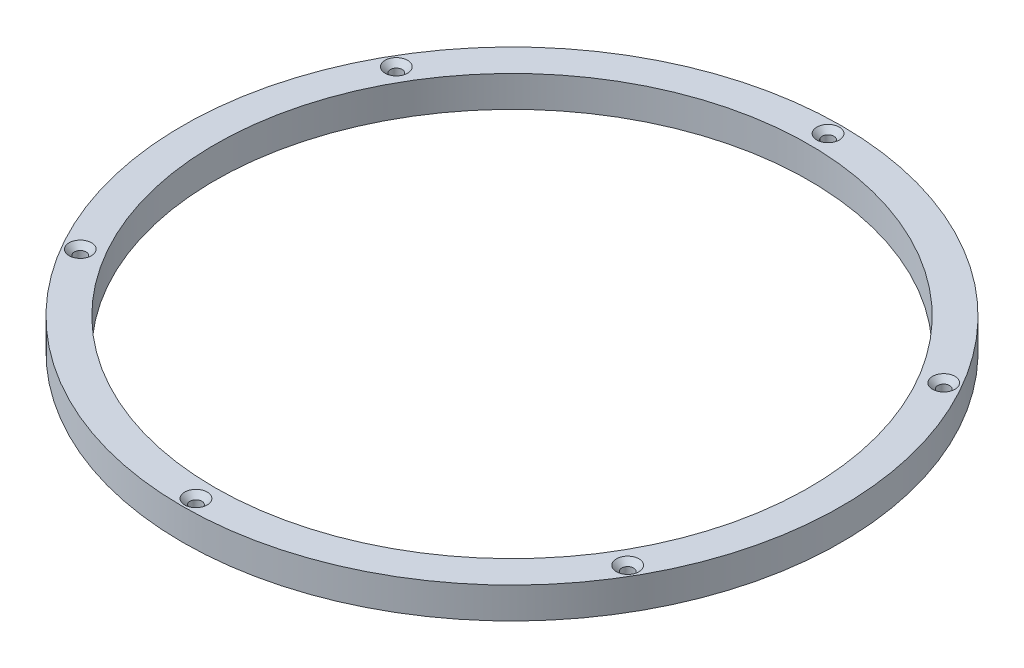
ISO-10303-21;
HEADER;
FILE_DESCRIPTION(('STEP AP214'),'2;1');
FILE_NAME('part.step','',(''),(''),'','','');
FILE_SCHEMA(('AUTOMOTIVE_DESIGN { 1 0 10303 214 1 1 1 1 }'));
ENDSEC;
DATA;
#1=APPLICATION_CONTEXT('core data for automotive mechanical design processes');
#2=APPLICATION_PROTOCOL_DEFINITION('international standard','automotive_design',2000,#1);
#3=PRODUCT_CONTEXT('',#1,'mechanical');
#4=PRODUCT('Part','Part','',(#3));
#5=PRODUCT_RELATED_PRODUCT_CATEGORY('part','',(#4));
#6=PRODUCT_DEFINITION_FORMATION('','',#4);
#7=PRODUCT_DEFINITION_CONTEXT('part definition',#1,'design');
#8=PRODUCT_DEFINITION('design','',#6,#7);
#9=PRODUCT_DEFINITION_SHAPE('','',#8);
#10=(LENGTH_UNIT() NAMED_UNIT(*) SI_UNIT(.MILLI.,.METRE.));
#11=(NAMED_UNIT(*) PLANE_ANGLE_UNIT() SI_UNIT($,.RADIAN.));
#12=(NAMED_UNIT(*) SI_UNIT($,.STERADIAN.) SOLID_ANGLE_UNIT());
#13=UNCERTAINTY_MEASURE_WITH_UNIT(LENGTH_MEASURE(1.E-05),#10,'distance_accuracy_value','');
#14=(GEOMETRIC_REPRESENTATION_CONTEXT(3) GLOBAL_UNCERTAINTY_ASSIGNED_CONTEXT((#13)) GLOBAL_UNIT_ASSIGNED_CONTEXT((#10,
#11,#12)) REPRESENTATION_CONTEXT('',''));
#15=CARTESIAN_POINT('',(0.,0.,0.));
#16=DIRECTION('',(0.,0.,1.));
#17=DIRECTION('',(1.,0.,0.));
#18=AXIS2_PLACEMENT_3D('',#15,#16,#17);
#19=CARTESIAN_POINT('',(0.,14.4,0.));
#20=DIRECTION('',(0.,1.,0.));
#21=DIRECTION('',(0.,0.,1.));
#22=AXIS2_PLACEMENT_3D('',#19,#20,#21);
#23=PLANE('',#22);
#24=CARTESIAN_POINT('',(126.656215303473,14.4,-73.1250000000015));
#25=DIRECTION('',(0.,1.,0.));
#26=DIRECTION('',(0.,0.,1.));
#27=AXIS2_PLACEMENT_3D('',#24,#25,#26);
#28=CIRCLE('',#27,5.20000000000001);
#29=CARTESIAN_POINT('',(126.656215303473,14.4,-67.9250000000015));
#30=VERTEX_POINT('',#29);
#31=EDGE_CURVE('E100',#30,#30,#28,.T.);
#32=ORIENTED_EDGE('',*,*,#31,.F.);
#33=EDGE_LOOP('',(#32));
#34=FACE_BOUND('',#33,.T.);
#35=CARTESIAN_POINT('',(126.656215303475,14.4,73.1249999999988));
#36=DIRECTION('',(0.,1.,0.));
#37=DIRECTION('',(0.,0.,1.));
#38=AXIS2_PLACEMENT_3D('',#35,#36,#37);
#39=CIRCLE('',#38,5.20000000000001);
#40=CARTESIAN_POINT('',(126.656215303475,14.4,78.3249999999988));
#41=VERTEX_POINT('',#40);
#42=EDGE_CURVE('E91',#41,#41,#39,.T.);
#43=ORIENTED_EDGE('',*,*,#42,.F.);
#44=EDGE_LOOP('',(#43));
#45=FACE_BOUND('',#44,.T.);
#46=CARTESIAN_POINT('',(0.,14.4,146.25));
#47=DIRECTION('',(0.,1.,0.));
#48=DIRECTION('',(0.,0.,1.));
#49=AXIS2_PLACEMENT_3D('',#46,#47,#48);
#50=CIRCLE('',#49,5.2);
#51=CARTESIAN_POINT('',(0.,14.4,151.45));
#52=VERTEX_POINT('',#51);
#53=EDGE_CURVE('E82',#52,#52,#50,.T.);
#54=ORIENTED_EDGE('',*,*,#53,.F.);
#55=EDGE_LOOP('',(#54));
#56=FACE_BOUND('',#55,.T.);
#57=CARTESIAN_POINT('',(-126.656215303474,14.4,73.1250000000006));
#58=DIRECTION('',(0.,1.,0.));
#59=DIRECTION('',(0.,0.,1.));
#60=AXIS2_PLACEMENT_3D('',#57,#58,#59);
#61=CIRCLE('',#60,5.2);
#62=CARTESIAN_POINT('',(-126.656215303474,14.4,78.3250000000006));
#63=VERTEX_POINT('',#62);
#64=EDGE_CURVE('E73',#63,#63,#61,.T.);
#65=ORIENTED_EDGE('',*,*,#64,.F.);
#66=EDGE_LOOP('',(#65));
#67=FACE_BOUND('',#66,.T.);
#68=CARTESIAN_POINT('',(-126.656215303474,14.4,-73.1249999999997));
#69=DIRECTION('',(0.,1.,0.));
#70=DIRECTION('',(0.,0.,1.));
#71=AXIS2_PLACEMENT_3D('',#68,#69,#70);
#72=CIRCLE('',#71,5.2);
#73=CARTESIAN_POINT('',(-126.656215303474,14.4,-67.9249999999997));
#74=VERTEX_POINT('',#73);
#75=EDGE_CURVE('E64',#74,#74,#72,.T.);
#76=ORIENTED_EDGE('',*,*,#75,.F.);
#77=EDGE_LOOP('',(#76));
#78=FACE_BOUND('',#77,.T.);
#79=CARTESIAN_POINT('',(0.,14.4,-146.25));
#80=DIRECTION('',(0.,1.,0.));
#81=DIRECTION('',(0.,0.,1.));
#82=AXIS2_PLACEMENT_3D('',#79,#80,#81);
#83=CIRCLE('',#82,5.2);
#84=CARTESIAN_POINT('',(0.,14.4,-141.05));
#85=VERTEX_POINT('',#84);
#86=EDGE_CURVE('E55',#85,#85,#83,.T.);
#87=ORIENTED_EDGE('',*,*,#86,.F.);
#88=EDGE_LOOP('',(#87));
#89=FACE_BOUND('',#88,.T.);
#90=CARTESIAN_POINT('',(0.,14.4,0.));
#91=DIRECTION('',(0.,1.,0.));
#92=DIRECTION('',(0.,0.,1.));
#93=AXIS2_PLACEMENT_3D('',#90,#91,#92);
#94=CIRCLE('',#93,152.5);
#95=CARTESIAN_POINT('',(0.,14.4,152.5));
#96=VERTEX_POINT('',#95);
#97=EDGE_CURVE('E10',#96,#96,#94,.T.);
#98=ORIENTED_EDGE('',*,*,#97,.T.);
#99=EDGE_LOOP('',(#98));
#100=FACE_BOUND('',#99,.T.);
#101=CARTESIAN_POINT('',(0.,14.4,0.));
#102=DIRECTION('',(0.,1.,0.));
#103=DIRECTION('',(0.,0.,1.));
#104=AXIS2_PLACEMENT_3D('',#101,#102,#103);
#105=CIRCLE('',#104,137.5);
#106=CARTESIAN_POINT('',(0.,14.4,137.5));
#107=VERTEX_POINT('',#106);
#108=EDGE_CURVE('E42',#107,#107,#105,.T.);
#109=ORIENTED_EDGE('',*,*,#108,.F.);
#110=EDGE_LOOP('',(#109));
#111=FACE_BOUND('',#110,.T.);
#112=ADVANCED_FACE('F31',(#34,#45,#56,#67,#78,#89,#100,#111),#23,.T.);
#113=CARTESIAN_POINT('',(0.,0.,0.));
#114=DIRECTION('',(0.,1.,0.));
#115=DIRECTION('',(0.,0.,1.));
#116=AXIS2_PLACEMENT_3D('',#113,#114,#115);
#117=PLANE('',#116);
#118=CARTESIAN_POINT('',(126.656215303473,0.,-73.1250000000015));
#119=DIRECTION('',(0.,1.,0.));
#120=DIRECTION('',(0.,0.,1.));
#121=AXIS2_PLACEMENT_3D('',#118,#119,#120);
#122=CIRCLE('',#121,2.74999999999997);
#123=CARTESIAN_POINT('',(126.656215303473,0.,-70.3750000000015));
#124=VERTEX_POINT('',#123);
#125=EDGE_CURVE('E94',#124,#124,#122,.T.);
#126=ORIENTED_EDGE('',*,*,#125,.T.);
#127=EDGE_LOOP('',(#126));
#128=FACE_BOUND('',#127,.T.);
#129=CARTESIAN_POINT('',(126.656215303475,0.,73.1249999999988));
#130=DIRECTION('',(0.,1.,0.));
#131=DIRECTION('',(0.,0.,1.));
#132=AXIS2_PLACEMENT_3D('',#129,#130,#131);
#133=CIRCLE('',#132,2.74999999999997);
#134=CARTESIAN_POINT('',(126.656215303475,0.,75.8749999999988));
#135=VERTEX_POINT('',#134);
#136=EDGE_CURVE('E85',#135,#135,#133,.T.);
#137=ORIENTED_EDGE('',*,*,#136,.T.);
#138=EDGE_LOOP('',(#137));
#139=FACE_BOUND('',#138,.T.);
#140=CARTESIAN_POINT('',(0.,0.,146.25));
#141=DIRECTION('',(0.,1.,0.));
#142=DIRECTION('',(0.,0.,1.));
#143=AXIS2_PLACEMENT_3D('',#140,#141,#142);
#144=CIRCLE('',#143,2.74999999999998);
#145=CARTESIAN_POINT('',(0.,0.,149.));
#146=VERTEX_POINT('',#145);
#147=EDGE_CURVE('E76',#146,#146,#144,.T.);
#148=ORIENTED_EDGE('',*,*,#147,.T.);
#149=EDGE_LOOP('',(#148));
#150=FACE_BOUND('',#149,.T.);
#151=CARTESIAN_POINT('',(-126.656215303474,0.,73.1250000000006));
#152=DIRECTION('',(0.,1.,0.));
#153=DIRECTION('',(0.,0.,1.));
#154=AXIS2_PLACEMENT_3D('',#151,#152,#153);
#155=CIRCLE('',#154,2.74999999999997);
#156=CARTESIAN_POINT('',(-126.656215303474,0.,75.8750000000006));
#157=VERTEX_POINT('',#156);
#158=EDGE_CURVE('E67',#157,#157,#155,.T.);
#159=ORIENTED_EDGE('',*,*,#158,.T.);
#160=EDGE_LOOP('',(#159));
#161=FACE_BOUND('',#160,.T.);
#162=CARTESIAN_POINT('',(-126.656215303474,0.,-73.1249999999997));
#163=DIRECTION('',(0.,1.,0.));
#164=DIRECTION('',(0.,0.,1.));
#165=AXIS2_PLACEMENT_3D('',#162,#163,#164);
#166=CIRCLE('',#165,2.74999999999997);
#167=CARTESIAN_POINT('',(-126.656215303474,0.,-70.3749999999997));
#168=VERTEX_POINT('',#167);
#169=EDGE_CURVE('E58',#168,#168,#166,.T.);
#170=ORIENTED_EDGE('',*,*,#169,.T.);
#171=EDGE_LOOP('',(#170));
#172=FACE_BOUND('',#171,.T.);
#173=CARTESIAN_POINT('',(0.,0.,-146.25));
#174=DIRECTION('',(0.,1.,0.));
#175=DIRECTION('',(0.,0.,1.));
#176=AXIS2_PLACEMENT_3D('',#173,#174,#175);
#177=CIRCLE('',#176,2.74999999999998);
#178=CARTESIAN_POINT('',(0.,0.,-143.5));
#179=VERTEX_POINT('',#178);
#180=EDGE_CURVE('E47',#179,#179,#177,.T.);
#181=ORIENTED_EDGE('',*,*,#180,.T.);
#182=EDGE_LOOP('',(#181));
#183=FACE_BOUND('',#182,.T.);
#184=CARTESIAN_POINT('',(0.,0.,0.));
#185=DIRECTION('',(0.,1.,0.));
#186=DIRECTION('',(0.,0.,1.));
#187=AXIS2_PLACEMENT_3D('',#184,#185,#186);
#188=CIRCLE('',#187,152.5);
#189=CARTESIAN_POINT('',(0.,0.,152.5));
#190=VERTEX_POINT('',#189);
#191=EDGE_CURVE('E35',#190,#190,#188,.T.);
#192=ORIENTED_EDGE('',*,*,#191,.F.);
#193=EDGE_LOOP('',(#192));
#194=FACE_BOUND('',#193,.T.);
#195=CARTESIAN_POINT('',(0.,0.,0.));
#196=DIRECTION('',(0.,1.,0.));
#197=DIRECTION('',(0.,0.,1.));
#198=AXIS2_PLACEMENT_3D('',#195,#196,#197);
#199=CIRCLE('',#198,137.5);
#200=CARTESIAN_POINT('',(0.,0.,137.5));
#201=VERTEX_POINT('',#200);
#202=EDGE_CURVE('E44',#201,#201,#199,.T.);
#203=ORIENTED_EDGE('',*,*,#202,.T.);
#204=EDGE_LOOP('',(#203));
#205=FACE_BOUND('',#204,.T.);
#206=ADVANCED_FACE('F108',(#128,#139,#150,#161,#172,#183,#194,#205),#117,.F.);
#207=CARTESIAN_POINT('',(0.,14.4,0.));
#208=DIRECTION('',(0.,-1.,0.));
#209=DIRECTION('',(0.,0.,-1.));
#210=AXIS2_PLACEMENT_3D('',#207,#208,#209);
#211=CYLINDRICAL_SURFACE('',#210,152.5);
#212=ORIENTED_EDGE('',*,*,#97,.F.);
#213=EDGE_LOOP('',(#212));
#214=FACE_BOUND('',#213,.T.);
#215=ORIENTED_EDGE('',*,*,#191,.T.);
#216=EDGE_LOOP('',(#215));
#217=FACE_BOUND('',#216,.T.);
#218=ADVANCED_FACE('F33',(#214,#217),#211,.T.);
#219=CARTESIAN_POINT('',(0.,14.4,0.));
#220=DIRECTION('',(0.,-1.,0.));
#221=DIRECTION('',(0.,0.,-1.));
#222=AXIS2_PLACEMENT_3D('',#219,#220,#221);
#223=CYLINDRICAL_SURFACE('',#222,137.5);
#224=ORIENTED_EDGE('',*,*,#108,.T.);
#225=EDGE_LOOP('',(#224));
#226=FACE_BOUND('',#225,.T.);
#227=ORIENTED_EDGE('',*,*,#202,.F.);
#228=EDGE_LOOP('',(#227));
#229=FACE_BOUND('',#228,.T.);
#230=ADVANCED_FACE('F122',(#226,#229),#223,.F.);
#231=CARTESIAN_POINT('',(0.,14.4,-146.25));
#232=DIRECTION('',(0.,1.,0.));
#233=DIRECTION('',(0.,0.,1.));
#234=AXIS2_PLACEMENT_3D('',#231,#232,#233);
#235=CYLINDRICAL_SURFACE('',#234,2.74999999999998);
#236=ORIENTED_EDGE('',*,*,#180,.F.);
#237=EDGE_LOOP('',(#236));
#238=FACE_BOUND('',#237,.T.);
#239=CARTESIAN_POINT('',(0.,11.95,-146.25));
#240=DIRECTION('',(0.,1.,0.));
#241=DIRECTION('',(0.,0.,1.));
#242=AXIS2_PLACEMENT_3D('',#239,#240,#241);
#243=CIRCLE('',#242,2.74999999999998);
#244=CARTESIAN_POINT('',(0.,11.95,-143.5));
#245=VERTEX_POINT('',#244);
#246=EDGE_CURVE('E52',#245,#245,#243,.T.);
#247=ORIENTED_EDGE('',*,*,#246,.T.);
#248=EDGE_LOOP('',(#247));
#249=FACE_BOUND('',#248,.T.);
#250=ADVANCED_FACE('F125',(#238,#249),#235,.F.);
#251=CARTESIAN_POINT('',(0.,14.4,-146.25));
#252=DIRECTION('',(0.,1.,0.));
#253=DIRECTION('',(0.,0.,1.));
#254=AXIS2_PLACEMENT_3D('',#251,#252,#253);
#255=CONICAL_SURFACE('',#254,5.2,0.785398163397445);
#256=ORIENTED_EDGE('',*,*,#246,.F.);
#257=EDGE_LOOP('',(#256));
#258=FACE_BOUND('',#257,.T.);
#259=ORIENTED_EDGE('',*,*,#86,.T.);
#260=EDGE_LOOP('',(#259));
#261=FACE_BOUND('',#260,.T.);
#262=ADVANCED_FACE('F139',(#258,#261),#255,.F.);
#263=CARTESIAN_POINT('',(-126.656215303474,14.4,-73.1249999999997));
#264=DIRECTION('',(0.,1.,0.));
#265=DIRECTION('',(0.,0.,1.));
#266=AXIS2_PLACEMENT_3D('',#263,#264,#265);
#267=CYLINDRICAL_SURFACE('',#266,2.74999999999998);
#268=ORIENTED_EDGE('',*,*,#169,.F.);
#269=EDGE_LOOP('',(#268));
#270=FACE_BOUND('',#269,.T.);
#271=CARTESIAN_POINT('',(-126.656215303474,11.95,-73.1249999999997));
#272=DIRECTION('',(0.,1.,0.));
#273=DIRECTION('',(0.,0.,1.));
#274=AXIS2_PLACEMENT_3D('',#271,#272,#273);
#275=CIRCLE('',#274,2.74999999999999);
#276=CARTESIAN_POINT('',(-126.656215303474,11.95,-70.3749999999997));
#277=VERTEX_POINT('',#276);
#278=EDGE_CURVE('E61',#277,#277,#275,.T.);
#279=ORIENTED_EDGE('',*,*,#278,.T.);
#280=EDGE_LOOP('',(#279));
#281=FACE_BOUND('',#280,.T.);
#282=ADVANCED_FACE('F143',(#270,#281),#267,.F.);
#283=CARTESIAN_POINT('',(-126.656215303474,14.4,-73.1249999999997));
#284=DIRECTION('',(0.,1.,0.));
#285=DIRECTION('',(0.,0.,1.));
#286=AXIS2_PLACEMENT_3D('',#283,#284,#285);
#287=CONICAL_SURFACE('',#286,5.2,0.785398163397443);
#288=ORIENTED_EDGE('',*,*,#278,.F.);
#289=EDGE_LOOP('',(#288));
#290=FACE_BOUND('',#289,.T.);
#291=ORIENTED_EDGE('',*,*,#75,.T.);
#292=EDGE_LOOP('',(#291));
#293=FACE_BOUND('',#292,.T.);
#294=ADVANCED_FACE('F147',(#290,#293),#287,.F.);
#295=CARTESIAN_POINT('',(-126.656215303474,14.4,73.1250000000006));
#296=DIRECTION('',(0.,1.,0.));
#297=DIRECTION('',(0.,0.,1.));
#298=AXIS2_PLACEMENT_3D('',#295,#296,#297);
#299=CYLINDRICAL_SURFACE('',#298,2.74999999999998);
#300=ORIENTED_EDGE('',*,*,#158,.F.);
#301=EDGE_LOOP('',(#300));
#302=FACE_BOUND('',#301,.T.);
#303=CARTESIAN_POINT('',(-126.656215303474,11.95,73.1250000000006));
#304=DIRECTION('',(0.,1.,0.));
#305=DIRECTION('',(0.,0.,1.));
#306=AXIS2_PLACEMENT_3D('',#303,#304,#305);
#307=CIRCLE('',#306,2.74999999999999);
#308=CARTESIAN_POINT('',(-126.656215303474,11.95,75.8750000000006));
#309=VERTEX_POINT('',#308);
#310=EDGE_CURVE('E70',#309,#309,#307,.T.);
#311=ORIENTED_EDGE('',*,*,#310,.T.);
#312=EDGE_LOOP('',(#311));
#313=FACE_BOUND('',#312,.T.);
#314=ADVANCED_FACE('F151',(#302,#313),#299,.F.);
#315=CARTESIAN_POINT('',(-126.656215303474,14.4,73.1250000000006));
#316=DIRECTION('',(0.,1.,0.));
#317=DIRECTION('',(0.,0.,1.));
#318=AXIS2_PLACEMENT_3D('',#315,#316,#317);
#319=CONICAL_SURFACE('',#318,5.2,0.785398163397443);
#320=ORIENTED_EDGE('',*,*,#310,.F.);
#321=EDGE_LOOP('',(#320));
#322=FACE_BOUND('',#321,.T.);
#323=ORIENTED_EDGE('',*,*,#64,.T.);
#324=EDGE_LOOP('',(#323));
#325=FACE_BOUND('',#324,.T.);
#326=ADVANCED_FACE('F155',(#322,#325),#319,.F.);
#327=CARTESIAN_POINT('',(0.,14.4,146.25));
#328=DIRECTION('',(0.,1.,0.));
#329=DIRECTION('',(0.,0.,1.));
#330=AXIS2_PLACEMENT_3D('',#327,#328,#329);
#331=CYLINDRICAL_SURFACE('',#330,2.74999999999998);
#332=ORIENTED_EDGE('',*,*,#147,.F.);
#333=EDGE_LOOP('',(#332));
#334=FACE_BOUND('',#333,.T.);
#335=CARTESIAN_POINT('',(0.,11.95,146.25));
#336=DIRECTION('',(0.,1.,0.));
#337=DIRECTION('',(0.,0.,1.));
#338=AXIS2_PLACEMENT_3D('',#335,#336,#337);
#339=CIRCLE('',#338,2.74999999999998);
#340=CARTESIAN_POINT('',(0.,11.95,149.));
#341=VERTEX_POINT('',#340);
#342=EDGE_CURVE('E79',#341,#341,#339,.T.);
#343=ORIENTED_EDGE('',*,*,#342,.T.);
#344=EDGE_LOOP('',(#343));
#345=FACE_BOUND('',#344,.T.);
#346=ADVANCED_FACE('F159',(#334,#345),#331,.F.);
#347=CARTESIAN_POINT('',(0.,14.4,146.25));
#348=DIRECTION('',(0.,1.,0.));
#349=DIRECTION('',(0.,0.,1.));
#350=AXIS2_PLACEMENT_3D('',#347,#348,#349);
#351=CONICAL_SURFACE('',#350,5.2,0.785398163397445);
#352=ORIENTED_EDGE('',*,*,#342,.F.);
#353=EDGE_LOOP('',(#352));
#354=FACE_BOUND('',#353,.T.);
#355=ORIENTED_EDGE('',*,*,#53,.T.);
#356=EDGE_LOOP('',(#355));
#357=FACE_BOUND('',#356,.T.);
#358=ADVANCED_FACE('F163',(#354,#357),#351,.F.);
#359=CARTESIAN_POINT('',(126.656215303475,14.4,73.1249999999988));
#360=DIRECTION('',(0.,1.,0.));
#361=DIRECTION('',(0.,0.,1.));
#362=AXIS2_PLACEMENT_3D('',#359,#360,#361);
#363=CYLINDRICAL_SURFACE('',#362,2.74999999999997);
#364=ORIENTED_EDGE('',*,*,#136,.F.);
#365=EDGE_LOOP('',(#364));
#366=FACE_BOUND('',#365,.T.);
#367=CARTESIAN_POINT('',(126.656215303475,11.95,73.1249999999988));
#368=DIRECTION('',(0.,1.,0.));
#369=DIRECTION('',(0.,0.,1.));
#370=AXIS2_PLACEMENT_3D('',#367,#368,#369);
#371=CIRCLE('',#370,2.74999999999997);
#372=CARTESIAN_POINT('',(126.656215303475,11.95,75.8749999999988));
#373=VERTEX_POINT('',#372);
#374=EDGE_CURVE('E88',#373,#373,#371,.T.);
#375=ORIENTED_EDGE('',*,*,#374,.T.);
#376=EDGE_LOOP('',(#375));
#377=FACE_BOUND('',#376,.T.);
#378=ADVANCED_FACE('F167',(#366,#377),#363,.F.);
#379=CARTESIAN_POINT('',(126.656215303475,14.4,73.1249999999988));
#380=DIRECTION('',(0.,1.,0.));
#381=DIRECTION('',(0.,0.,1.));
#382=AXIS2_PLACEMENT_3D('',#379,#380,#381);
#383=CONICAL_SURFACE('',#382,5.20000000000001,0.785398163397448);
#384=ORIENTED_EDGE('',*,*,#374,.F.);
#385=EDGE_LOOP('',(#384));
#386=FACE_BOUND('',#385,.T.);
#387=ORIENTED_EDGE('',*,*,#42,.T.);
#388=EDGE_LOOP('',(#387));
#389=FACE_BOUND('',#388,.T.);
#390=ADVANCED_FACE('F171',(#386,#389),#383,.F.);
#391=CARTESIAN_POINT('',(126.656215303473,14.4,-73.1250000000015));
#392=DIRECTION('',(0.,1.,0.));
#393=DIRECTION('',(0.,0.,1.));
#394=AXIS2_PLACEMENT_3D('',#391,#392,#393);
#395=CYLINDRICAL_SURFACE('',#394,2.74999999999997);
#396=ORIENTED_EDGE('',*,*,#125,.F.);
#397=EDGE_LOOP('',(#396));
#398=FACE_BOUND('',#397,.T.);
#399=CARTESIAN_POINT('',(126.656215303473,11.95,-73.1250000000015));
#400=DIRECTION('',(0.,1.,0.));
#401=DIRECTION('',(0.,0.,1.));
#402=AXIS2_PLACEMENT_3D('',#399,#400,#401);
#403=CIRCLE('',#402,2.74999999999997);
#404=CARTESIAN_POINT('',(126.656215303473,11.95,-70.3750000000015));
#405=VERTEX_POINT('',#404);
#406=EDGE_CURVE('E97',#405,#405,#403,.T.);
#407=ORIENTED_EDGE('',*,*,#406,.T.);
#408=EDGE_LOOP('',(#407));
#409=FACE_BOUND('',#408,.T.);
#410=ADVANCED_FACE('F175',(#398,#409),#395,.F.);
#411=CARTESIAN_POINT('',(126.656215303473,14.4,-73.1250000000015));
#412=DIRECTION('',(0.,1.,0.));
#413=DIRECTION('',(0.,0.,1.));
#414=AXIS2_PLACEMENT_3D('',#411,#412,#413);
#415=CONICAL_SURFACE('',#414,5.20000000000001,0.785398163397448);
#416=ORIENTED_EDGE('',*,*,#406,.F.);
#417=EDGE_LOOP('',(#416));
#418=FACE_BOUND('',#417,.T.);
#419=ORIENTED_EDGE('',*,*,#31,.T.);
#420=EDGE_LOOP('',(#419));
#421=FACE_BOUND('',#420,.T.);
#422=ADVANCED_FACE('F104',(#418,#421),#415,.F.);
#423=CLOSED_SHELL('',(#112,#206,#218,#230,#250,#262,#282,#294,#314,#326,#346,#358,#378,#390,
#410,#422));
#424=MANIFOLD_SOLID_BREP('B2',#423);
#425=ADVANCED_BREP_SHAPE_REPRESENTATION('',(#18,#424),#14);
#426=SHAPE_DEFINITION_REPRESENTATION(#9,#425);
ENDSEC;
END-ISO-10303-21;
